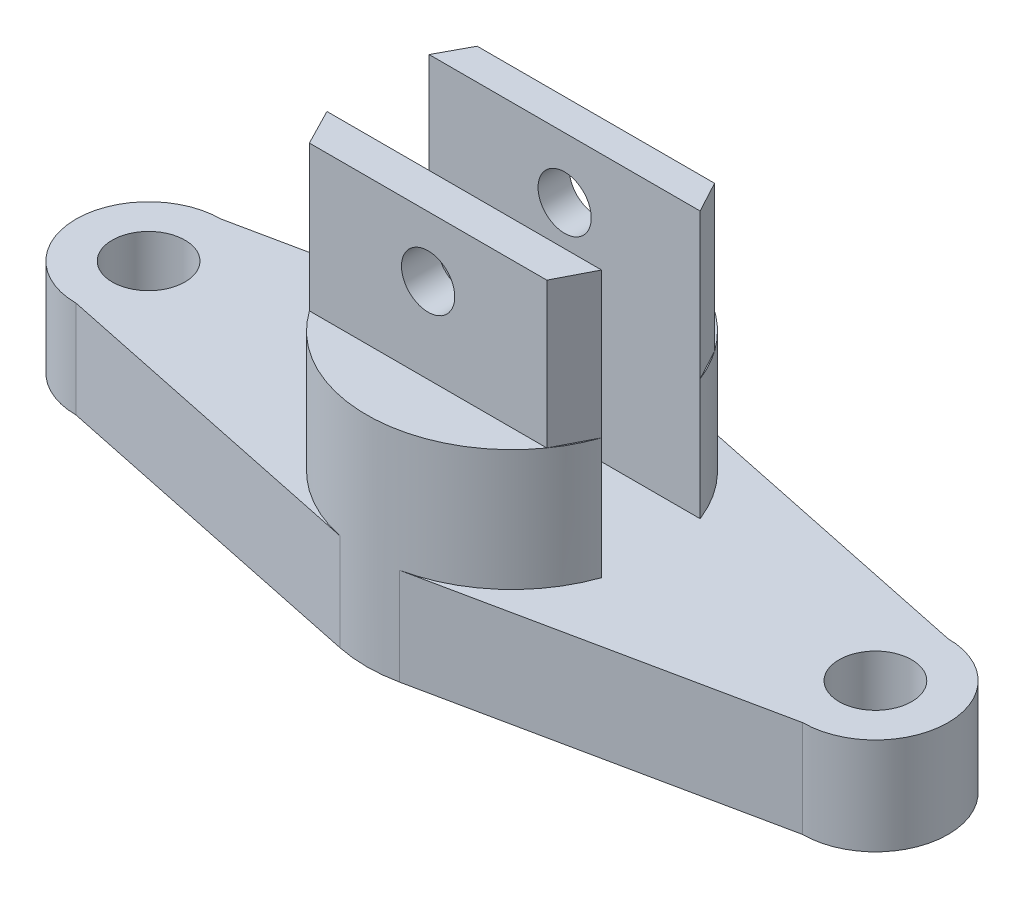
ISO-10303-21;
HEADER;
FILE_DESCRIPTION(('STEP AP214'),'2;1');
FILE_NAME('part.step','',(''),(''),'','','');
FILE_SCHEMA(('AUTOMOTIVE_DESIGN { 1 0 10303 214 1 1 1 1 }'));
ENDSEC;
DATA;
#1=APPLICATION_CONTEXT('core data for automotive mechanical design processes');
#2=APPLICATION_PROTOCOL_DEFINITION('international standard','automotive_design',2000,#1);
#3=PRODUCT_CONTEXT('',#1,'mechanical');
#4=PRODUCT('Part','Part','',(#3));
#5=PRODUCT_RELATED_PRODUCT_CATEGORY('part','',(#4));
#6=PRODUCT_DEFINITION_FORMATION('','',#4);
#7=PRODUCT_DEFINITION_CONTEXT('part definition',#1,'design');
#8=PRODUCT_DEFINITION('design','',#6,#7);
#9=PRODUCT_DEFINITION_SHAPE('','',#8);
#10=(LENGTH_UNIT() NAMED_UNIT(*) SI_UNIT(.MILLI.,.METRE.));
#11=(NAMED_UNIT(*) PLANE_ANGLE_UNIT() SI_UNIT($,.RADIAN.));
#12=(NAMED_UNIT(*) SI_UNIT($,.STERADIAN.) SOLID_ANGLE_UNIT());
#13=UNCERTAINTY_MEASURE_WITH_UNIT(LENGTH_MEASURE(1.E-05),#10,'distance_accuracy_value','');
#14=(GEOMETRIC_REPRESENTATION_CONTEXT(3) GLOBAL_UNCERTAINTY_ASSIGNED_CONTEXT((#13)) GLOBAL_UNIT_ASSIGNED_CONTEXT((#10,
#11,#12)) REPRESENTATION_CONTEXT('',''));
#15=CARTESIAN_POINT('',(0.,0.,0.));
#16=DIRECTION('',(0.,0.,1.));
#17=DIRECTION('',(1.,0.,0.));
#18=AXIS2_PLACEMENT_3D('',#15,#16,#17);
#19=CARTESIAN_POINT('',(0.,45.,0.));
#20=DIRECTION('',(0.,1.,0.));
#21=DIRECTION('',(0.,0.,1.));
#22=AXIS2_PLACEMENT_3D('',#19,#20,#21);
#23=PLANE('',#22);
#24=DIRECTION('',(0.457296961848008,0.,-0.88931405514845));
#25=VECTOR('',#24,1.);
#26=CARTESIAN_POINT('',(24.5006156305825,45.,17.3124184827671));
#27=LINE('',#26,#25);
#28=CARTESIAN_POINT('',(24.5006156305825,45.,17.3124184827671));
#29=VERTEX_POINT('',#28);
#30=CARTESIAN_POINT('',(28.3347031045593,45.,9.85619601958471));
#31=VERTEX_POINT('',#30);
#32=EDGE_CURVE('E63',#29,#31,#27,.T.);
#33=ORIENTED_EDGE('',*,*,#32,.F.);
#34=CARTESIAN_POINT('',(0.,45.,0.));
#35=DIRECTION('',(0.,1.,0.));
#36=DIRECTION('',(0.,0.,1.));
#37=AXIS2_PLACEMENT_3D('',#34,#35,#36);
#38=CIRCLE('',#37,30.);
#39=EDGE_CURVE('E271',#29,#31,#38,.T.);
#40=ORIENTED_EDGE('',*,*,#39,.T.);
#41=EDGE_LOOP('',(#33,#40));
#42=FACE_BOUND('',#41,.T.);
#43=ADVANCED_FACE('F45',(#42),#23,.T.);
#44=DIRECTION('',(1.,0.,0.));
#45=VECTOR('',#44,1.);
#46=CARTESIAN_POINT('',(-24.5006156305825,45.,17.3124184827671));
#47=LINE('',#46,#45);
#48=CARTESIAN_POINT('',(-24.5006156305825,45.,17.3124184827671));
#49=VERTEX_POINT('',#48);
#50=EDGE_CURVE('E231',#49,#29,#47,.T.);
#51=ORIENTED_EDGE('',*,*,#50,.F.);
#52=EDGE_CURVE('E270',#49,#29,#38,.T.);
#53=ORIENTED_EDGE('',*,*,#52,.T.);
#54=EDGE_LOOP('',(#51,#53));
#55=FACE_BOUND('',#54,.T.);
#56=ADVANCED_FACE('F464',(#55),#23,.T.);
#57=DIRECTION('',(-0.473108241665216,0.,0.881004308541365));
#58=VECTOR('',#57,1.);
#59=CARTESIAN_POINT('',(-27.9645931491844,45.,-10.8619303072974));
#60=LINE('',#59,#58);
#61=CARTESIAN_POINT('',(-24.5006156305825,45.,-17.3124184827671));
#62=VERTEX_POINT('',#61);
#63=CARTESIAN_POINT('',(-27.9645931491844,45.,-10.8619303072974));
#64=VERTEX_POINT('',#63);
#65=EDGE_CURVE('E70',#62,#64,#60,.T.);
#66=ORIENTED_EDGE('',*,*,#65,.F.);
#67=EDGE_CURVE('E269',#62,#64,#38,.T.);
#68=ORIENTED_EDGE('',*,*,#67,.T.);
#69=EDGE_LOOP('',(#66,#68));
#70=FACE_BOUND('',#69,.T.);
#71=ADVANCED_FACE('F493',(#70),#23,.T.);
#72=DIRECTION('',(-1.,0.,0.));
#73=VECTOR('',#72,1.);
#74=CARTESIAN_POINT('',(-24.5006156305825,45.,-17.3124184827671));
#75=LINE('',#74,#73);
#76=CARTESIAN_POINT('',(24.5006156305825,45.,-17.3124184827671));
#77=VERTEX_POINT('',#76);
#78=EDGE_CURVE('E196',#77,#62,#75,.T.);
#79=ORIENTED_EDGE('',*,*,#78,.F.);
#80=EDGE_CURVE('E408',#77,#62,#38,.T.);
#81=ORIENTED_EDGE('',*,*,#80,.T.);
#82=EDGE_LOOP('',(#79,#81));
#83=FACE_BOUND('',#82,.T.);
#84=ADVANCED_FACE('F436',(#83),#23,.T.);
#85=CARTESIAN_POINT('',(0.,20.,0.));
#86=DIRECTION('',(0.,-1.,0.));
#87=DIRECTION('',(0.,0.,-1.));
#88=AXIS2_PLACEMENT_3D('',#85,#86,#87);
#89=CYLINDRICAL_SURFACE('',#88,30.);
#90=DIRECTION('',(0.,-1.,0.));
#91=VECTOR('',#90,1.);
#92=CARTESIAN_POINT('',(28.3347031045593,20.,9.85619601958471));
#93=LINE('',#92,#91);
#94=CARTESIAN_POINT('',(28.3347031045593,20.,9.85619601958471));
#95=VERTEX_POINT('',#94);
#96=EDGE_CURVE('E263',#31,#95,#93,.T.);
#97=ORIENTED_EDGE('',*,*,#96,.F.);
#98=ORIENTED_EDGE('',*,*,#39,.F.);
#99=ORIENTED_EDGE('',*,*,#52,.F.);
#100=CARTESIAN_POINT('',(-28.3347031045593,45.,9.85619601958471));
#101=VERTEX_POINT('',#100);
#102=EDGE_CURVE('E267',#101,#49,#38,.T.);
#103=ORIENTED_EDGE('',*,*,#102,.F.);
#104=DIRECTION('',(0.,-1.,0.));
#105=VECTOR('',#104,1.);
#106=CARTESIAN_POINT('',(-28.3347031045593,20.,9.85619601958471));
#107=LINE('',#106,#105);
#108=CARTESIAN_POINT('',(-28.3347031045593,20.,9.85619601958471));
#109=VERTEX_POINT('',#108);
#110=EDGE_CURVE('E259',#109,#101,#107,.F.);
#111=ORIENTED_EDGE('',*,*,#110,.F.);
#112=CARTESIAN_POINT('',(0.,20.,0.));
#113=DIRECTION('',(0.,1.,0.));
#114=DIRECTION('',(0.,0.,1.));
#115=AXIS2_PLACEMENT_3D('',#112,#113,#114);
#116=CIRCLE('',#115,30.);
#117=CARTESIAN_POINT('',(-6.1264433540499,20.,29.3677832297506));
#118=VERTEX_POINT('',#117);
#119=EDGE_CURVE('E55',#109,#118,#116,.T.);
#120=ORIENTED_EDGE('',*,*,#119,.T.);
#121=DIRECTION('',(0.,-1.,0.));
#122=VECTOR('',#121,1.);
#123=CARTESIAN_POINT('',(-6.1264433540499,20.,29.3677832297506));
#124=LINE('',#123,#122);
#125=CARTESIAN_POINT('',(-6.1264433540499,0.,29.3677832297506));
#126=VERTEX_POINT('',#125);
#127=EDGE_CURVE('E362',#118,#126,#124,.T.);
#128=ORIENTED_EDGE('',*,*,#127,.T.);
#129=CARTESIAN_POINT('',(0.,0.,0.));
#130=DIRECTION('',(0.,1.,0.));
#131=DIRECTION('',(0.,0.,1.));
#132=AXIS2_PLACEMENT_3D('',#129,#130,#131);
#133=CIRCLE('',#132,30.);
#134=CARTESIAN_POINT('',(6.12644335404989,0.,29.3677832297506));
#135=VERTEX_POINT('',#134);
#136=EDGE_CURVE('E322',#126,#135,#133,.T.);
#137=ORIENTED_EDGE('',*,*,#136,.T.);
#138=DIRECTION('',(0.,-1.,0.));
#139=VECTOR('',#138,1.);
#140=CARTESIAN_POINT('',(6.12644335404989,20.,29.3677832297506));
#141=LINE('',#140,#139);
#142=CARTESIAN_POINT('',(6.12644335404989,20.,29.3677832297506));
#143=VERTEX_POINT('',#142);
#144=EDGE_CURVE('E358',#143,#135,#141,.T.);
#145=ORIENTED_EDGE('',*,*,#144,.F.);
#146=EDGE_CURVE('E57',#143,#95,#116,.T.);
#147=ORIENTED_EDGE('',*,*,#146,.T.);
#148=EDGE_LOOP('',(#97,#98,#99,#103,#111,#120,#128,#137,#145,#147));
#149=FACE_BOUND('',#148,.T.);
#150=ADVANCED_FACE('F446',(#149),#89,.T.);
#151=DIRECTION('',(0.,-1.,0.));
#152=VECTOR('',#151,1.);
#153=CARTESIAN_POINT('',(-27.9645931491844,20.,-10.8619303072974));
#154=LINE('',#153,#152);
#155=CARTESIAN_POINT('',(-27.9645931491844,20.,-10.8619303072974));
#156=VERTEX_POINT('',#155);
#157=EDGE_CURVE('E256',#64,#156,#154,.T.);
#158=ORIENTED_EDGE('',*,*,#157,.F.);
#159=ORIENTED_EDGE('',*,*,#67,.F.);
#160=ORIENTED_EDGE('',*,*,#80,.F.);
#161=CARTESIAN_POINT('',(27.9645931491844,45.,-10.8619303072974));
#162=VERTEX_POINT('',#161);
#163=EDGE_CURVE('E272',#162,#77,#38,.T.);
#164=ORIENTED_EDGE('',*,*,#163,.F.);
#165=DIRECTION('',(0.,-1.,0.));
#166=VECTOR('',#165,1.);
#167=CARTESIAN_POINT('',(27.9645931491844,20.,-10.8619303072974));
#168=LINE('',#167,#166);
#169=CARTESIAN_POINT('',(27.9645931491844,20.,-10.8619303072974));
#170=VERTEX_POINT('',#169);
#171=EDGE_CURVE('E253',#170,#162,#168,.F.);
#172=ORIENTED_EDGE('',*,*,#171,.F.);
#173=CARTESIAN_POINT('',(6.12644335404989,20.,-29.3677832297505));
#174=VERTEX_POINT('',#173);
#175=EDGE_CURVE('E266',#170,#174,#116,.T.);
#176=ORIENTED_EDGE('',*,*,#175,.T.);
#177=DIRECTION('',(0.,-1.,0.));
#178=VECTOR('',#177,1.);
#179=CARTESIAN_POINT('',(6.12644335404989,20.,-29.3677832297505));
#180=LINE('',#179,#178);
#181=CARTESIAN_POINT('',(6.12644335404989,0.,-29.3677832297505));
#182=VERTEX_POINT('',#181);
#183=EDGE_CURVE('E346',#174,#182,#180,.T.);
#184=ORIENTED_EDGE('',*,*,#183,.T.);
#185=CARTESIAN_POINT('',(0.,0.,0.));
#186=DIRECTION('',(0.,1.,0.));
#187=DIRECTION('',(0.,0.,1.));
#188=AXIS2_PLACEMENT_3D('',#185,#186,#187);
#189=CIRCLE('',#188,30.);
#190=CARTESIAN_POINT('',(-6.12644335404989,0.,-29.3677832297505));
#191=VERTEX_POINT('',#190);
#192=EDGE_CURVE('E334',#182,#191,#189,.T.);
#193=ORIENTED_EDGE('',*,*,#192,.T.);
#194=DIRECTION('',(0.,-1.,0.));
#195=VECTOR('',#194,1.);
#196=CARTESIAN_POINT('',(-6.12644335404989,20.,-29.3677832297505));
#197=LINE('',#196,#195);
#198=CARTESIAN_POINT('',(-6.12644335404989,20.,-29.3677832297505));
#199=VERTEX_POINT('',#198);
#200=EDGE_CURVE('E342',#199,#191,#197,.T.);
#201=ORIENTED_EDGE('',*,*,#200,.F.);
#202=EDGE_CURVE('E11',#199,#156,#116,.T.);
#203=ORIENTED_EDGE('',*,*,#202,.T.);
#204=EDGE_LOOP('',(#158,#159,#160,#164,#172,#176,#184,#193,#201,#203));
#205=FACE_BOUND('',#204,.T.);
#206=ADVANCED_FACE('F379',(#205),#89,.T.);
#207=DIRECTION('',(0.457296961848008,0.,0.88931405514845));
#208=VECTOR('',#207,1.);
#209=CARTESIAN_POINT('',(-28.3347031045593,45.,9.85619601958471));
#210=LINE('',#209,#208);
#211=EDGE_CURVE('E236',#101,#49,#210,.T.);
#212=ORIENTED_EDGE('',*,*,#211,.F.);
#213=ORIENTED_EDGE('',*,*,#102,.T.);
#214=EDGE_LOOP('',(#212,#213));
#215=FACE_BOUND('',#214,.T.);
#216=ADVANCED_FACE('F468',(#215),#23,.T.);
#217=DIRECTION('',(-0.473108241665217,0.,-0.881004308541364));
#218=VECTOR('',#217,1.);
#219=CARTESIAN_POINT('',(24.5006156305825,45.,-17.3124184827671));
#220=LINE('',#219,#218);
#221=EDGE_CURVE('E416',#162,#77,#220,.T.);
#222=ORIENTED_EDGE('',*,*,#221,.F.);
#223=ORIENTED_EDGE('',*,*,#163,.T.);
#224=EDGE_LOOP('',(#222,#223));
#225=FACE_BOUND('',#224,.T.);
#226=ADVANCED_FACE('F497',(#225),#23,.T.);
#227=CARTESIAN_POINT('',(-75.,20.,0.));
#228=DIRECTION('',(0.,1.,0.));
#229=DIRECTION('',(0.,0.,1.));
#230=AXIS2_PLACEMENT_3D('',#227,#228,#229);
#231=PLANE('',#230);
#232=DIRECTION('',(-1.,0.,0.));
#233=VECTOR('',#232,1.);
#234=CARTESIAN_POINT('',(35.,20.,9.85619601958471));
#235=LINE('',#234,#233);
#236=EDGE_CURVE('E205',#95,#109,#235,.T.);
#237=ORIENTED_EDGE('',*,*,#236,.F.);
#238=ORIENTED_EDGE('',*,*,#146,.F.);
#239=DIRECTION('',(0.978926107658352,0.,-0.20421477846833));
#240=VECTOR('',#239,1.);
#241=CARTESIAN_POINT('',(75.,20.,15.));
#242=LINE('',#241,#240);
#243=CARTESIAN_POINT('',(75.,20.,15.));
#244=VERTEX_POINT('',#243);
#245=EDGE_CURVE('E302',#143,#244,#242,.T.);
#246=ORIENTED_EDGE('',*,*,#245,.T.);
#247=CARTESIAN_POINT('',(75.,20.,0.));
#248=DIRECTION('',(0.,1.,0.));
#249=DIRECTION('',(0.,0.,-1.));
#250=AXIS2_PLACEMENT_3D('',#247,#248,#249);
#251=CIRCLE('',#250,15.);
#252=CARTESIAN_POINT('',(75.,20.,-15.));
#253=VERTEX_POINT('',#252);
#254=EDGE_CURVE('E305',#244,#253,#251,.T.);
#255=ORIENTED_EDGE('',*,*,#254,.T.);
#256=DIRECTION('',(-0.978926107658352,0.,-0.204214778468329));
#257=VECTOR('',#256,1.);
#258=CARTESIAN_POINT('',(75.,20.,-15.));
#259=LINE('',#258,#257);
#260=EDGE_CURVE('E308',#253,#174,#259,.T.);
#261=ORIENTED_EDGE('',*,*,#260,.T.);
#262=ORIENTED_EDGE('',*,*,#175,.F.);
#263=DIRECTION('',(-1.,0.,0.));
#264=VECTOR('',#263,1.);
#265=CARTESIAN_POINT('',(35.,20.,-10.8619303072974));
#266=LINE('',#265,#264);
#267=EDGE_CURVE('E200',#170,#156,#266,.T.);
#268=ORIENTED_EDGE('',*,*,#267,.T.);
#269=ORIENTED_EDGE('',*,*,#202,.F.);
#270=DIRECTION('',(-0.978926107658352,0.,0.204214778468329));
#271=VECTOR('',#270,1.);
#272=CARTESIAN_POINT('',(-75.,20.,-15.));
#273=LINE('',#272,#271);
#274=CARTESIAN_POINT('',(-75.,20.,-15.));
#275=VERTEX_POINT('',#274);
#276=EDGE_CURVE('E312',#199,#275,#273,.T.);
#277=ORIENTED_EDGE('',*,*,#276,.T.);
#278=CARTESIAN_POINT('',(-75.,20.,0.));
#279=DIRECTION('',(0.,1.,0.));
#280=DIRECTION('',(0.,0.,1.));
#281=AXIS2_PLACEMENT_3D('',#278,#279,#280);
#282=CIRCLE('',#281,15.);
#283=CARTESIAN_POINT('',(-75.,20.,15.));
#284=VERTEX_POINT('',#283);
#285=EDGE_CURVE('E293',#275,#284,#282,.T.);
#286=ORIENTED_EDGE('',*,*,#285,.T.);
#287=DIRECTION('',(0.978926107658352,0.,0.20421477846833));
#288=VECTOR('',#287,1.);
#289=CARTESIAN_POINT('',(-75.,20.,15.));
#290=LINE('',#289,#288);
#291=EDGE_CURVE('E297',#284,#118,#290,.T.);
#292=ORIENTED_EDGE('',*,*,#291,.T.);
#293=ORIENTED_EDGE('',*,*,#119,.F.);
#294=EDGE_LOOP('',(#237,#238,#246,#255,#261,#262,#268,#269,#277,#286,#292,#293));
#295=FACE_BOUND('',#294,.T.);
#296=CARTESIAN_POINT('',(-75.,20.,0.));
#297=DIRECTION('',(0.,1.,0.));
#298=DIRECTION('',(0.,0.,1.));
#299=AXIS2_PLACEMENT_3D('',#296,#297,#298);
#300=CIRCLE('',#299,7.5);
#301=CARTESIAN_POINT('',(-75.,20.,7.5));
#302=VERTEX_POINT('',#301);
#303=EDGE_CURVE('E276',#302,#302,#300,.T.);
#304=ORIENTED_EDGE('',*,*,#303,.F.);
#305=EDGE_LOOP('',(#304));
#306=FACE_BOUND('',#305,.T.);
#307=CARTESIAN_POINT('',(75.,20.,0.));
#308=DIRECTION('',(0.,1.,0.));
#309=DIRECTION('',(0.,0.,1.));
#310=AXIS2_PLACEMENT_3D('',#307,#308,#309);
#311=CIRCLE('',#310,7.5);
#312=CARTESIAN_POINT('',(75.,20.,7.5));
#313=VERTEX_POINT('',#312);
#314=EDGE_CURVE('E285',#313,#313,#311,.T.);
#315=ORIENTED_EDGE('',*,*,#314,.F.);
#316=EDGE_LOOP('',(#315));
#317=FACE_BOUND('',#316,.T.);
#318=ADVANCED_FACE('F386',(#295,#306,#317),#231,.T.);
#319=CARTESIAN_POINT('',(-75.,0.,0.));
#320=DIRECTION('',(0.,1.,0.));
#321=DIRECTION('',(0.,0.,1.));
#322=AXIS2_PLACEMENT_3D('',#319,#320,#321);
#323=PLANE('',#322);
#324=CARTESIAN_POINT('',(-75.,0.,0.));
#325=DIRECTION('',(0.,1.,0.));
#326=DIRECTION('',(0.,0.,1.));
#327=AXIS2_PLACEMENT_3D('',#324,#325,#326);
#328=CIRCLE('',#327,15.);
#329=CARTESIAN_POINT('',(-75.,0.,-15.));
#330=VERTEX_POINT('',#329);
#331=CARTESIAN_POINT('',(-75.,0.,15.));
#332=VERTEX_POINT('',#331);
#333=EDGE_CURVE('E289',#330,#332,#328,.T.);
#334=ORIENTED_EDGE('',*,*,#333,.F.);
#335=DIRECTION('',(-0.978926107658352,0.,0.204214778468329));
#336=VECTOR('',#335,1.);
#337=CARTESIAN_POINT('',(-75.,0.,-15.));
#338=LINE('',#337,#336);
#339=EDGE_CURVE('E298',#191,#330,#338,.T.);
#340=ORIENTED_EDGE('',*,*,#339,.F.);
#341=ORIENTED_EDGE('',*,*,#192,.F.);
#342=DIRECTION('',(-0.978926107658352,0.,-0.204214778468329));
#343=VECTOR('',#342,1.);
#344=CARTESIAN_POINT('',(75.,0.,-15.));
#345=LINE('',#344,#343);
#346=CARTESIAN_POINT('',(75.,0.,-15.));
#347=VERTEX_POINT('',#346);
#348=EDGE_CURVE('E331',#347,#182,#345,.T.);
#349=ORIENTED_EDGE('',*,*,#348,.F.);
#350=CARTESIAN_POINT('',(75.,0.,0.));
#351=DIRECTION('',(0.,1.,0.));
#352=DIRECTION('',(0.,0.,-1.));
#353=AXIS2_PLACEMENT_3D('',#350,#351,#352);
#354=CIRCLE('',#353,15.);
#355=CARTESIAN_POINT('',(75.,0.,15.));
#356=VERTEX_POINT('',#355);
#357=EDGE_CURVE('E328',#356,#347,#354,.T.);
#358=ORIENTED_EDGE('',*,*,#357,.F.);
#359=DIRECTION('',(0.978926107658352,0.,-0.20421477846833));
#360=VECTOR('',#359,1.);
#361=CARTESIAN_POINT('',(75.,0.,15.));
#362=LINE('',#361,#360);
#363=EDGE_CURVE('E325',#135,#356,#362,.T.);
#364=ORIENTED_EDGE('',*,*,#363,.F.);
#365=ORIENTED_EDGE('',*,*,#136,.F.);
#366=DIRECTION('',(0.978926107658352,0.,0.20421477846833));
#367=VECTOR('',#366,1.);
#368=CARTESIAN_POINT('',(-75.,0.,15.));
#369=LINE('',#368,#367);
#370=EDGE_CURVE('E319',#332,#126,#369,.T.);
#371=ORIENTED_EDGE('',*,*,#370,.F.);
#372=EDGE_LOOP('',(#334,#340,#341,#349,#358,#364,#365,#371));
#373=FACE_BOUND('',#372,.T.);
#374=CARTESIAN_POINT('',(75.,0.,0.));
#375=DIRECTION('',(0.,1.,0.));
#376=DIRECTION('',(0.,0.,1.));
#377=AXIS2_PLACEMENT_3D('',#374,#375,#376);
#378=CIRCLE('',#377,7.5);
#379=CARTESIAN_POINT('',(75.,0.,7.5));
#380=VERTEX_POINT('',#379);
#381=EDGE_CURVE('E280',#380,#380,#378,.T.);
#382=ORIENTED_EDGE('',*,*,#381,.T.);
#383=EDGE_LOOP('',(#382));
#384=FACE_BOUND('',#383,.T.);
#385=CARTESIAN_POINT('',(-75.,0.,0.));
#386=DIRECTION('',(0.,1.,0.));
#387=DIRECTION('',(0.,0.,1.));
#388=AXIS2_PLACEMENT_3D('',#385,#386,#387);
#389=CIRCLE('',#388,7.5);
#390=CARTESIAN_POINT('',(-75.,0.,7.5));
#391=VERTEX_POINT('',#390);
#392=EDGE_CURVE('E281',#391,#391,#389,.T.);
#393=ORIENTED_EDGE('',*,*,#392,.T.);
#394=EDGE_LOOP('',(#393));
#395=FACE_BOUND('',#394,.T.);
#396=ADVANCED_FACE('F396',(#373,#384,#395),#323,.F.);
#397=CARTESIAN_POINT('',(-75.,20.,0.));
#398=DIRECTION('',(0.,-1.,0.));
#399=DIRECTION('',(0.,0.,-1.));
#400=AXIS2_PLACEMENT_3D('',#397,#398,#399);
#401=CYLINDRICAL_SURFACE('',#400,15.);
#402=ORIENTED_EDGE('',*,*,#333,.T.);
#403=DIRECTION('',(0.,-1.,0.));
#404=VECTOR('',#403,1.);
#405=CARTESIAN_POINT('',(-75.,20.,15.));
#406=LINE('',#405,#404);
#407=EDGE_CURVE('E365',#284,#332,#406,.T.);
#408=ORIENTED_EDGE('',*,*,#407,.F.);
#409=ORIENTED_EDGE('',*,*,#285,.F.);
#410=DIRECTION('',(0.,-1.,0.));
#411=VECTOR('',#410,1.);
#412=CARTESIAN_POINT('',(-75.,20.,-15.));
#413=LINE('',#412,#411);
#414=EDGE_CURVE('E315',#275,#330,#413,.T.);
#415=ORIENTED_EDGE('',*,*,#414,.T.);
#416=EDGE_LOOP('',(#402,#408,#409,#415));
#417=FACE_BOUND('',#416,.T.);
#418=ADVANCED_FACE('F47',(#417),#401,.T.);
#419=CARTESIAN_POINT('',(-75.,20.,15.));
#420=DIRECTION('',(0.20421477846833,0.,-0.978926107658352));
#421=DIRECTION('',(-0.978926107658352,0.,-0.20421477846833));
#422=AXIS2_PLACEMENT_3D('',#419,#420,#421);
#423=PLANE('',#422);
#424=ORIENTED_EDGE('',*,*,#370,.T.);
#425=ORIENTED_EDGE('',*,*,#127,.F.);
#426=ORIENTED_EDGE('',*,*,#291,.F.);
#427=ORIENTED_EDGE('',*,*,#407,.T.);
#428=EDGE_LOOP('',(#424,#425,#426,#427));
#429=FACE_BOUND('',#428,.T.);
#430=ADVANCED_FACE('F471',(#429),#423,.F.);
#431=CARTESIAN_POINT('',(75.,20.,15.));
#432=DIRECTION('',(-0.20421477846833,0.,-0.978926107658352));
#433=DIRECTION('',(-0.978926107658352,0.,0.20421477846833));
#434=AXIS2_PLACEMENT_3D('',#431,#432,#433);
#435=PLANE('',#434);
#436=ORIENTED_EDGE('',*,*,#363,.T.);
#437=DIRECTION('',(0.,-1.,0.));
#438=VECTOR('',#437,1.);
#439=CARTESIAN_POINT('',(75.,20.,15.));
#440=LINE('',#439,#438);
#441=EDGE_CURVE('E354',#244,#356,#440,.T.);
#442=ORIENTED_EDGE('',*,*,#441,.F.);
#443=ORIENTED_EDGE('',*,*,#245,.F.);
#444=ORIENTED_EDGE('',*,*,#144,.T.);
#445=EDGE_LOOP('',(#436,#442,#443,#444));
#446=FACE_BOUND('',#445,.T.);
#447=ADVANCED_FACE('F475',(#446),#435,.F.);
#448=CARTESIAN_POINT('',(75.,20.,0.));
#449=DIRECTION('',(0.,-1.,0.));
#450=DIRECTION('',(0.,0.,-1.));
#451=AXIS2_PLACEMENT_3D('',#448,#449,#450);
#452=CYLINDRICAL_SURFACE('',#451,15.);
#453=ORIENTED_EDGE('',*,*,#357,.T.);
#454=DIRECTION('',(0.,-1.,0.));
#455=VECTOR('',#454,1.);
#456=CARTESIAN_POINT('',(75.,20.,-15.));
#457=LINE('',#456,#455);
#458=EDGE_CURVE('E350',#253,#347,#457,.T.);
#459=ORIENTED_EDGE('',*,*,#458,.F.);
#460=ORIENTED_EDGE('',*,*,#254,.F.);
#461=ORIENTED_EDGE('',*,*,#441,.T.);
#462=EDGE_LOOP('',(#453,#459,#460,#461));
#463=FACE_BOUND('',#462,.T.);
#464=ADVANCED_FACE('F477',(#463),#452,.T.);
#465=CARTESIAN_POINT('',(75.,20.,-15.));
#466=DIRECTION('',(-0.204214778468329,0.,0.978926107658352));
#467=DIRECTION('',(0.978926107658352,0.,0.204214778468329));
#468=AXIS2_PLACEMENT_3D('',#465,#466,#467);
#469=PLANE('',#468);
#470=ORIENTED_EDGE('',*,*,#348,.T.);
#471=ORIENTED_EDGE('',*,*,#183,.F.);
#472=ORIENTED_EDGE('',*,*,#260,.F.);
#473=ORIENTED_EDGE('',*,*,#458,.T.);
#474=EDGE_LOOP('',(#470,#471,#472,#473));
#475=FACE_BOUND('',#474,.T.);
#476=ADVANCED_FACE('F391',(#475),#469,.F.);
#477=CARTESIAN_POINT('',(-75.,20.,-15.));
#478=DIRECTION('',(0.204214778468329,0.,0.978926107658352));
#479=DIRECTION('',(0.978926107658352,0.,-0.204214778468329));
#480=AXIS2_PLACEMENT_3D('',#477,#478,#479);
#481=PLANE('',#480);
#482=ORIENTED_EDGE('',*,*,#339,.T.);
#483=ORIENTED_EDGE('',*,*,#414,.F.);
#484=ORIENTED_EDGE('',*,*,#276,.F.);
#485=ORIENTED_EDGE('',*,*,#200,.T.);
#486=EDGE_LOOP('',(#482,#483,#484,#485));
#487=FACE_BOUND('',#486,.T.);
#488=ADVANCED_FACE('F403',(#487),#481,.F.);
#489=CARTESIAN_POINT('',(75.,20.,0.));
#490=DIRECTION('',(0.,-1.,0.));
#491=DIRECTION('',(0.,0.,-1.));
#492=AXIS2_PLACEMENT_3D('',#489,#490,#491);
#493=CYLINDRICAL_SURFACE('',#492,7.5);
#494=ORIENTED_EDGE('',*,*,#314,.T.);
#495=EDGE_LOOP('',(#494));
#496=FACE_BOUND('',#495,.T.);
#497=ORIENTED_EDGE('',*,*,#381,.F.);
#498=EDGE_LOOP('',(#497));
#499=FACE_BOUND('',#498,.T.);
#500=ADVANCED_FACE('F509',(#496,#499),#493,.F.);
#501=CARTESIAN_POINT('',(-75.,20.,0.));
#502=DIRECTION('',(0.,-1.,0.));
#503=DIRECTION('',(0.,0.,-1.));
#504=AXIS2_PLACEMENT_3D('',#501,#502,#503);
#505=CYLINDRICAL_SURFACE('',#504,7.5);
#506=ORIENTED_EDGE('',*,*,#303,.T.);
#507=EDGE_LOOP('',(#506));
#508=FACE_BOUND('',#507,.T.);
#509=ORIENTED_EDGE('',*,*,#392,.F.);
#510=EDGE_LOOP('',(#509));
#511=FACE_BOUND('',#510,.T.);
#512=ADVANCED_FACE('F513',(#508,#511),#505,.F.);
#513=CARTESIAN_POINT('',(35.,45.,9.85619601958471));
#514=DIRECTION('',(0.,0.,-1.));
#515=DIRECTION('',(-1.,0.,0.));
#516=AXIS2_PLACEMENT_3D('',#513,#514,#515);
#517=PLANE('',#516);
#518=CARTESIAN_POINT('',(0.,62.511511295153,9.85619601958471));
#519=DIRECTION('',(0.,0.,-1.));
#520=DIRECTION('',(-1.,0.,0.));
#521=AXIS2_PLACEMENT_3D('',#518,#519,#520);
#522=CIRCLE('',#521,5.49238852402966);
#523=CARTESIAN_POINT('',(-5.49238852402966,62.511511295153,9.85619601958471));
#524=VERTEX_POINT('',#523);
#525=EDGE_CURVE('E216',#524,#524,#522,.F.);
#526=ORIENTED_EDGE('',*,*,#525,.T.);
#527=EDGE_LOOP('',(#526));
#528=FACE_BOUND('',#527,.T.);
#529=ORIENTED_EDGE('',*,*,#96,.T.);
#530=ORIENTED_EDGE('',*,*,#236,.T.);
#531=ORIENTED_EDGE('',*,*,#110,.T.);
#532=DIRECTION('',(0.,-1.,0.));
#533=VECTOR('',#532,1.);
#534=CARTESIAN_POINT('',(-28.3347031045593,75.,9.85619601958471));
#535=LINE('',#534,#533);
#536=CARTESIAN_POINT('',(-28.3347031045593,75.,9.85619601958471));
#537=VERTEX_POINT('',#536);
#538=EDGE_CURVE('E211',#537,#101,#535,.T.);
#539=ORIENTED_EDGE('',*,*,#538,.F.);
#540=DIRECTION('',(-1.,0.,0.));
#541=VECTOR('',#540,1.);
#542=CARTESIAN_POINT('',(28.3347031045593,75.,9.85619601958471));
#543=LINE('',#542,#541);
#544=CARTESIAN_POINT('',(28.3347031045593,75.,9.85619601958471));
#545=VERTEX_POINT('',#544);
#546=EDGE_CURVE('E232',#545,#537,#543,.T.);
#547=ORIENTED_EDGE('',*,*,#546,.F.);
#548=DIRECTION('',(0.,-1.,0.));
#549=VECTOR('',#548,1.);
#550=CARTESIAN_POINT('',(28.3347031045593,75.,9.85619601958471));
#551=LINE('',#550,#549);
#552=EDGE_CURVE('E224',#545,#31,#551,.T.);
#553=ORIENTED_EDGE('',*,*,#552,.T.);
#554=EDGE_LOOP('',(#529,#530,#531,#539,#547,#553));
#555=FACE_BOUND('',#554,.T.);
#556=ADVANCED_FACE('F456',(#528,#555),#517,.T.);
#557=CARTESIAN_POINT('',(35.,45.,-10.8619303072974));
#558=DIRECTION('',(0.,0.,1.));
#559=DIRECTION('',(1.,0.,0.));
#560=AXIS2_PLACEMENT_3D('',#557,#558,#559);
#561=PLANE('',#560);
#562=CARTESIAN_POINT('',(0.,62.511511295153,-10.8619303072974));
#563=DIRECTION('',(0.,0.,1.));
#564=DIRECTION('',(1.,0.,0.));
#565=AXIS2_PLACEMENT_3D('',#562,#563,#564);
#566=CIRCLE('',#565,5.49238852402966);
#567=CARTESIAN_POINT('',(5.49238852402966,62.511511295153,-10.8619303072974));
#568=VERTEX_POINT('',#567);
#569=EDGE_CURVE('E571',#568,#568,#566,.F.);
#570=ORIENTED_EDGE('',*,*,#569,.T.);
#571=EDGE_LOOP('',(#570));
#572=FACE_BOUND('',#571,.T.);
#573=ORIENTED_EDGE('',*,*,#157,.T.);
#574=ORIENTED_EDGE('',*,*,#267,.F.);
#575=ORIENTED_EDGE('',*,*,#171,.T.);
#576=DIRECTION('',(0.,-1.,0.));
#577=VECTOR('',#576,1.);
#578=CARTESIAN_POINT('',(27.9645931491844,75.,-10.8619303072974));
#579=LINE('',#578,#577);
#580=CARTESIAN_POINT('',(27.9645931491844,75.,-10.8619303072974));
#581=VERTEX_POINT('',#580);
#582=EDGE_CURVE('E181',#581,#162,#579,.T.);
#583=ORIENTED_EDGE('',*,*,#582,.F.);
#584=DIRECTION('',(1.,0.,0.));
#585=VECTOR('',#584,1.);
#586=CARTESIAN_POINT('',(27.9645931491844,75.,-10.8619303072974));
#587=LINE('',#586,#585);
#588=CARTESIAN_POINT('',(-27.9645931491844,75.,-10.8619303072974));
#589=VERTEX_POINT('',#588);
#590=EDGE_CURVE('E174',#589,#581,#587,.T.);
#591=ORIENTED_EDGE('',*,*,#590,.F.);
#592=DIRECTION('',(0.,-1.,0.));
#593=VECTOR('',#592,1.);
#594=CARTESIAN_POINT('',(-27.9645931491844,75.,-10.8619303072974));
#595=LINE('',#594,#593);
#596=EDGE_CURVE('E178',#589,#64,#595,.T.);
#597=ORIENTED_EDGE('',*,*,#596,.T.);
#598=EDGE_LOOP('',(#573,#574,#575,#583,#591,#597));
#599=FACE_BOUND('',#598,.T.);
#600=ADVANCED_FACE('F176',(#572,#599),#561,.T.);
#601=CARTESIAN_POINT('',(-27.9645931491844,75.,-10.8619303072974));
#602=DIRECTION('',(0.881004308541365,0.,0.473108241665216));
#603=DIRECTION('',(0.473108241665216,0.,-0.881004308541365));
#604=AXIS2_PLACEMENT_3D('',#601,#602,#603);
#605=PLANE('',#604);
#606=ORIENTED_EDGE('',*,*,#65,.T.);
#607=ORIENTED_EDGE('',*,*,#596,.F.);
#608=DIRECTION('',(-0.473108241665216,0.,0.881004308541365));
#609=VECTOR('',#608,1.);
#610=CARTESIAN_POINT('',(-27.9645931491844,75.,-10.8619303072974));
#611=LINE('',#610,#609);
#612=CARTESIAN_POINT('',(-24.5006156305825,75.,-17.3124184827671));
#613=VERTEX_POINT('',#612);
#614=EDGE_CURVE('E186',#613,#589,#611,.T.);
#615=ORIENTED_EDGE('',*,*,#614,.F.);
#616=DIRECTION('',(0.,-1.,0.));
#617=VECTOR('',#616,1.);
#618=CARTESIAN_POINT('',(-24.5006156305825,75.,-17.3124184827671));
#619=LINE('',#618,#617);
#620=EDGE_CURVE('E421',#613,#62,#619,.T.);
#621=ORIENTED_EDGE('',*,*,#620,.T.);
#622=EDGE_LOOP('',(#606,#607,#615,#621));
#623=FACE_BOUND('',#622,.T.);
#624=ADVANCED_FACE('F198',(#623),#605,.F.);
#625=CARTESIAN_POINT('',(24.5006156305825,75.,-17.3124184827671));
#626=DIRECTION('',(-0.881004308541364,0.,0.473108241665217));
#627=DIRECTION('',(0.473108241665217,0.,0.881004308541364));
#628=AXIS2_PLACEMENT_3D('',#625,#626,#627);
#629=PLANE('',#628);
#630=ORIENTED_EDGE('',*,*,#221,.T.);
#631=DIRECTION('',(0.,-1.,0.));
#632=VECTOR('',#631,1.);
#633=CARTESIAN_POINT('',(24.5006156305825,75.,-17.3124184827671));
#634=LINE('',#633,#632);
#635=CARTESIAN_POINT('',(24.5006156305825,75.,-17.3124184827671));
#636=VERTEX_POINT('',#635);
#637=EDGE_CURVE('E207',#636,#77,#634,.T.);
#638=ORIENTED_EDGE('',*,*,#637,.F.);
#639=DIRECTION('',(-0.473108241665217,0.,-0.881004308541364));
#640=VECTOR('',#639,1.);
#641=CARTESIAN_POINT('',(24.5006156305825,75.,-17.3124184827671));
#642=LINE('',#641,#640);
#643=EDGE_CURVE('E185',#581,#636,#642,.T.);
#644=ORIENTED_EDGE('',*,*,#643,.F.);
#645=ORIENTED_EDGE('',*,*,#582,.T.);
#646=EDGE_LOOP('',(#630,#638,#644,#645));
#647=FACE_BOUND('',#646,.T.);
#648=ADVANCED_FACE('F414',(#647),#629,.F.);
#649=CARTESIAN_POINT('',(-24.5006156305825,75.,-17.3124184827671));
#650=DIRECTION('',(0.,0.,1.));
#651=DIRECTION('',(1.,0.,0.));
#652=AXIS2_PLACEMENT_3D('',#649,#650,#651);
#653=PLANE('',#652);
#654=CARTESIAN_POINT('',(0.,62.511511295153,-17.3124184827671));
#655=DIRECTION('',(0.,0.,1.));
#656=DIRECTION('',(1.,0.,0.));
#657=AXIS2_PLACEMENT_3D('',#654,#655,#656);
#658=CIRCLE('',#657,5.49238852402966);
#659=CARTESIAN_POINT('',(5.49238852402966,62.511511295153,-17.3124184827671));
#660=VERTEX_POINT('',#659);
#661=EDGE_CURVE('E568',#660,#660,#658,.F.);
#662=ORIENTED_EDGE('',*,*,#661,.F.);
#663=EDGE_LOOP('',(#662));
#664=FACE_BOUND('',#663,.T.);
#665=ORIENTED_EDGE('',*,*,#78,.T.);
#666=ORIENTED_EDGE('',*,*,#620,.F.);
#667=DIRECTION('',(-1.,0.,0.));
#668=VECTOR('',#667,1.);
#669=CARTESIAN_POINT('',(-24.5006156305825,75.,-17.3124184827671));
#670=LINE('',#669,#668);
#671=EDGE_CURVE('E191',#636,#613,#670,.T.);
#672=ORIENTED_EDGE('',*,*,#671,.F.);
#673=ORIENTED_EDGE('',*,*,#637,.T.);
#674=EDGE_LOOP('',(#665,#666,#672,#673));
#675=FACE_BOUND('',#674,.T.);
#676=ADVANCED_FACE('F434',(#664,#675),#653,.F.);
#677=CARTESIAN_POINT('',(0.,75.,0.));
#678=DIRECTION('',(0.,-1.,0.));
#679=DIRECTION('',(0.,0.,-1.));
#680=AXIS2_PLACEMENT_3D('',#677,#678,#679);
#681=PLANE('',#680);
#682=ORIENTED_EDGE('',*,*,#614,.T.);
#683=ORIENTED_EDGE('',*,*,#590,.T.);
#684=ORIENTED_EDGE('',*,*,#643,.T.);
#685=ORIENTED_EDGE('',*,*,#671,.T.);
#686=EDGE_LOOP('',(#682,#683,#684,#685));
#687=FACE_BOUND('',#686,.T.);
#688=ADVANCED_FACE('F189',(#687),#681,.F.);
#689=CARTESIAN_POINT('',(-28.3347031045593,75.,9.85619601958471));
#690=DIRECTION('',(0.88931405514845,0.,-0.457296961848008));
#691=DIRECTION('',(-0.457296961848008,0.,-0.88931405514845));
#692=AXIS2_PLACEMENT_3D('',#689,#690,#691);
#693=PLANE('',#692);
#694=ORIENTED_EDGE('',*,*,#211,.T.);
#695=DIRECTION('',(0.,-1.,0.));
#696=VECTOR('',#695,1.);
#697=CARTESIAN_POINT('',(-24.5006156305825,75.,17.3124184827671));
#698=LINE('',#697,#696);
#699=CARTESIAN_POINT('',(-24.5006156305825,75.,17.3124184827671));
#700=VERTEX_POINT('',#699);
#701=EDGE_CURVE('E215',#700,#49,#698,.T.);
#702=ORIENTED_EDGE('',*,*,#701,.F.);
#703=DIRECTION('',(0.457296961848008,0.,0.88931405514845));
#704=VECTOR('',#703,1.);
#705=CARTESIAN_POINT('',(-28.3347031045593,75.,9.85619601958471));
#706=LINE('',#705,#704);
#707=EDGE_CURVE('E245',#537,#700,#706,.T.);
#708=ORIENTED_EDGE('',*,*,#707,.F.);
#709=ORIENTED_EDGE('',*,*,#538,.T.);
#710=EDGE_LOOP('',(#694,#702,#708,#709));
#711=FACE_BOUND('',#710,.T.);
#712=ADVANCED_FACE('F466',(#711),#693,.F.);
#713=CARTESIAN_POINT('',(-24.5006156305825,75.,17.3124184827671));
#714=DIRECTION('',(0.,0.,-1.));
#715=DIRECTION('',(-1.,0.,0.));
#716=AXIS2_PLACEMENT_3D('',#713,#714,#715);
#717=PLANE('',#716);
#718=CARTESIAN_POINT('',(0.,62.511511295153,17.3124184827671));
#719=DIRECTION('',(0.,0.,-1.));
#720=DIRECTION('',(-1.,0.,0.));
#721=AXIS2_PLACEMENT_3D('',#718,#719,#720);
#722=CIRCLE('',#721,5.49238852402966);
#723=CARTESIAN_POINT('',(-5.49238852402966,62.511511295153,17.3124184827671));
#724=VERTEX_POINT('',#723);
#725=EDGE_CURVE('E49',#724,#724,#722,.F.);
#726=ORIENTED_EDGE('',*,*,#725,.F.);
#727=EDGE_LOOP('',(#726));
#728=FACE_BOUND('',#727,.T.);
#729=ORIENTED_EDGE('',*,*,#50,.T.);
#730=DIRECTION('',(0.,-1.,0.));
#731=VECTOR('',#730,1.);
#732=CARTESIAN_POINT('',(24.5006156305825,75.,17.3124184827671));
#733=LINE('',#732,#731);
#734=CARTESIAN_POINT('',(24.5006156305825,75.,17.3124184827671));
#735=VERTEX_POINT('',#734);
#736=EDGE_CURVE('E220',#735,#29,#733,.T.);
#737=ORIENTED_EDGE('',*,*,#736,.F.);
#738=DIRECTION('',(1.,0.,0.));
#739=VECTOR('',#738,1.);
#740=CARTESIAN_POINT('',(-24.5006156305825,75.,17.3124184827671));
#741=LINE('',#740,#739);
#742=EDGE_CURVE('E242',#700,#735,#741,.T.);
#743=ORIENTED_EDGE('',*,*,#742,.F.);
#744=ORIENTED_EDGE('',*,*,#701,.T.);
#745=EDGE_LOOP('',(#729,#737,#743,#744));
#746=FACE_BOUND('',#745,.T.);
#747=ADVANCED_FACE('F463',(#728,#746),#717,.F.);
#748=CARTESIAN_POINT('',(24.5006156305825,75.,17.3124184827671));
#749=DIRECTION('',(-0.88931405514845,0.,-0.457296961848008));
#750=DIRECTION('',(-0.457296961848008,0.,0.88931405514845));
#751=AXIS2_PLACEMENT_3D('',#748,#749,#750);
#752=PLANE('',#751);
#753=ORIENTED_EDGE('',*,*,#32,.T.);
#754=ORIENTED_EDGE('',*,*,#552,.F.);
#755=DIRECTION('',(0.457296961848008,0.,-0.88931405514845));
#756=VECTOR('',#755,1.);
#757=CARTESIAN_POINT('',(24.5006156305825,75.,17.3124184827671));
#758=LINE('',#757,#756);
#759=EDGE_CURVE('E228',#735,#545,#758,.T.);
#760=ORIENTED_EDGE('',*,*,#759,.F.);
#761=ORIENTED_EDGE('',*,*,#736,.T.);
#762=EDGE_LOOP('',(#753,#754,#760,#761));
#763=FACE_BOUND('',#762,.T.);
#764=ADVANCED_FACE('F452',(#763),#752,.F.);
#765=CARTESIAN_POINT('',(0.,75.,0.));
#766=DIRECTION('',(0.,1.,0.));
#767=DIRECTION('',(0.,0.,1.));
#768=AXIS2_PLACEMENT_3D('',#765,#766,#767);
#769=PLANE('',#768);
#770=ORIENTED_EDGE('',*,*,#546,.T.);
#771=ORIENTED_EDGE('',*,*,#707,.T.);
#772=ORIENTED_EDGE('',*,*,#742,.T.);
#773=ORIENTED_EDGE('',*,*,#759,.T.);
#774=EDGE_LOOP('',(#770,#771,#772,#773));
#775=FACE_BOUND('',#774,.T.);
#776=ADVANCED_FACE('F459',(#775),#769,.T.);
#777=CARTESIAN_POINT('',(0.,62.511511295153,32.3124184827671));
#778=DIRECTION('',(0.,0.,-1.));
#779=DIRECTION('',(-1.,0.,0.));
#780=AXIS2_PLACEMENT_3D('',#777,#778,#779);
#781=CYLINDRICAL_SURFACE('',#780,5.49238852402966);
#782=ORIENTED_EDGE('',*,*,#525,.F.);
#783=EDGE_LOOP('',(#782));
#784=FACE_BOUND('',#783,.T.);
#785=ORIENTED_EDGE('',*,*,#725,.T.);
#786=EDGE_LOOP('',(#785));
#787=FACE_BOUND('',#786,.T.);
#788=ADVANCED_FACE('F539',(#784,#787),#781,.F.);
#789=ORIENTED_EDGE('',*,*,#569,.F.);
#790=EDGE_LOOP('',(#789));
#791=FACE_BOUND('',#790,.T.);
#792=ORIENTED_EDGE('',*,*,#661,.T.);
#793=EDGE_LOOP('',(#792));
#794=FACE_BOUND('',#793,.T.);
#795=ADVANCED_FACE('F557',(#791,#794),#781,.F.);
#796=CLOSED_SHELL('',(#43,#56,#71,#84,#150,#206,#216,#226,#318,#396,#418,#430,#447,#464,#476,
#488,#500,#512,#556,#600,#624,#648,#676,#688,#712,#747,#764,#776,#788,#795));
#797=MANIFOLD_SOLID_BREP('B2',#796);
#798=ADVANCED_BREP_SHAPE_REPRESENTATION('',(#18,#797),#14);
#799=SHAPE_DEFINITION_REPRESENTATION(#9,#798);
ENDSEC;
END-ISO-10303-21;
